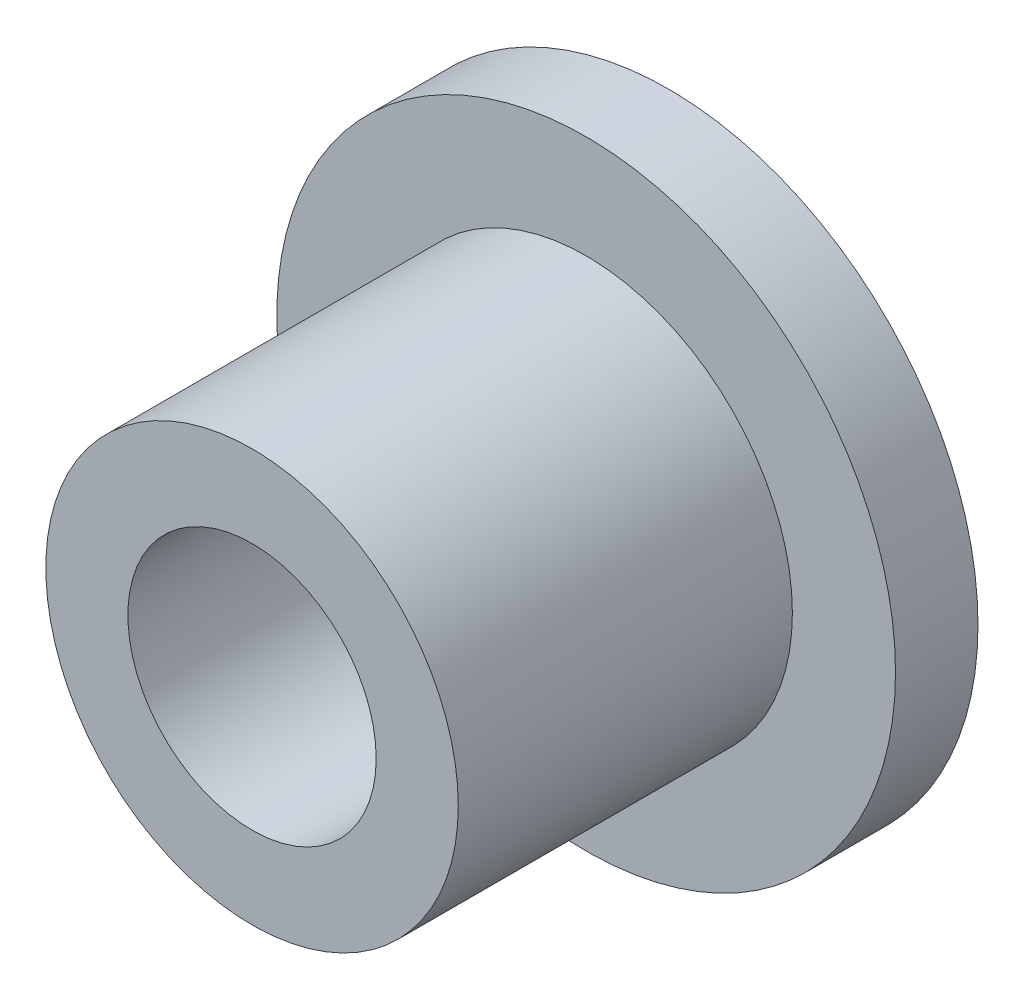
ISO-10303-21;
HEADER;
FILE_DESCRIPTION(('STEP AP214'),'2;1');
FILE_NAME('part.step','',(''),(''),'','','');
FILE_SCHEMA(('AUTOMOTIVE_DESIGN { 1 0 10303 214 1 1 1 1 }'));
ENDSEC;
DATA;
#1=APPLICATION_CONTEXT('core data for automotive mechanical design processes');
#2=APPLICATION_PROTOCOL_DEFINITION('international standard','automotive_design',2000,#1);
#3=PRODUCT_CONTEXT('',#1,'mechanical');
#4=PRODUCT('Part','Part','',(#3));
#5=PRODUCT_RELATED_PRODUCT_CATEGORY('part','',(#4));
#6=PRODUCT_DEFINITION_FORMATION('','',#4);
#7=PRODUCT_DEFINITION_CONTEXT('part definition',#1,'design');
#8=PRODUCT_DEFINITION('design','',#6,#7);
#9=PRODUCT_DEFINITION_SHAPE('','',#8);
#10=(LENGTH_UNIT() NAMED_UNIT(*) SI_UNIT(.MILLI.,.METRE.));
#11=(NAMED_UNIT(*) PLANE_ANGLE_UNIT() SI_UNIT($,.RADIAN.));
#12=(NAMED_UNIT(*) SI_UNIT($,.STERADIAN.) SOLID_ANGLE_UNIT());
#13=UNCERTAINTY_MEASURE_WITH_UNIT(LENGTH_MEASURE(1.E-05),#10,'distance_accuracy_value','');
#14=(GEOMETRIC_REPRESENTATION_CONTEXT(3) GLOBAL_UNCERTAINTY_ASSIGNED_CONTEXT((#13)) GLOBAL_UNIT_ASSIGNED_CONTEXT((#10,
#11,#12)) REPRESENTATION_CONTEXT('',''));
#15=CARTESIAN_POINT('',(0.,0.,0.));
#16=DIRECTION('',(0.,0.,1.));
#17=DIRECTION('',(1.,0.,0.));
#18=AXIS2_PLACEMENT_3D('',#15,#16,#17);
#19=CARTESIAN_POINT('',(0.,0.,2.));
#20=DIRECTION('',(0.,0.,1.));
#21=DIRECTION('',(1.,0.,0.));
#22=AXIS2_PLACEMENT_3D('',#19,#20,#21);
#23=PLANE('',#22);
#24=CARTESIAN_POINT('',(0.,0.,2.));
#25=DIRECTION('',(0.,0.,1.));
#26=DIRECTION('',(1.,0.,0.));
#27=AXIS2_PLACEMENT_3D('',#24,#25,#26);
#28=CIRCLE('',#27,5.);
#29=CARTESIAN_POINT('',(5.,0.,2.));
#30=VERTEX_POINT('',#29);
#31=EDGE_CURVE('E10',#30,#30,#28,.T.);
#32=ORIENTED_EDGE('',*,*,#31,.F.);
#33=EDGE_LOOP('',(#32));
#34=FACE_BOUND('',#33,.T.);
#35=CARTESIAN_POINT('',(0.,0.,2.));
#36=DIRECTION('',(0.,0.,1.));
#37=DIRECTION('',(1.,0.,0.));
#38=AXIS2_PLACEMENT_3D('',#35,#36,#37);
#39=CIRCLE('',#38,7.5);
#40=CARTESIAN_POINT('',(7.5,0.,2.));
#41=VERTEX_POINT('',#40);
#42=EDGE_CURVE('E44',#41,#41,#39,.T.);
#43=ORIENTED_EDGE('',*,*,#42,.T.);
#44=EDGE_LOOP('',(#43));
#45=FACE_BOUND('',#44,.T.);
#46=ADVANCED_FACE('F40',(#34,#45),#23,.T.);
#47=CARTESIAN_POINT('',(0.,0.,0.));
#48=DIRECTION('',(0.,0.,1.));
#49=DIRECTION('',(1.,0.,0.));
#50=AXIS2_PLACEMENT_3D('',#47,#48,#49);
#51=PLANE('',#50);
#52=CARTESIAN_POINT('',(0.,0.,0.));
#53=DIRECTION('',(0.,0.,1.));
#54=DIRECTION('',(1.,0.,0.));
#55=AXIS2_PLACEMENT_3D('',#52,#53,#54);
#56=CIRCLE('',#55,7.5);
#57=CARTESIAN_POINT('',(7.5,0.,0.));
#58=VERTEX_POINT('',#57);
#59=EDGE_CURVE('E41',#58,#58,#56,.T.);
#60=ORIENTED_EDGE('',*,*,#59,.F.);
#61=EDGE_LOOP('',(#60));
#62=FACE_BOUND('',#61,.T.);
#63=CARTESIAN_POINT('',(0.,0.,0.));
#64=DIRECTION('',(0.,0.,1.));
#65=DIRECTION('',(1.,0.,0.));
#66=AXIS2_PLACEMENT_3D('',#63,#64,#65);
#67=CIRCLE('',#66,3.01);
#68=CARTESIAN_POINT('',(3.01,0.,0.));
#69=VERTEX_POINT('',#68);
#70=EDGE_CURVE('E53',#69,#69,#67,.T.);
#71=ORIENTED_EDGE('',*,*,#70,.T.);
#72=EDGE_LOOP('',(#71));
#73=FACE_BOUND('',#72,.T.);
#74=ADVANCED_FACE('F82',(#62,#73),#51,.F.);
#75=CARTESIAN_POINT('',(0.,0.,2.));
#76=DIRECTION('',(0.,0.,-1.));
#77=DIRECTION('',(-1.,0.,0.));
#78=AXIS2_PLACEMENT_3D('',#75,#76,#77);
#79=CYLINDRICAL_SURFACE('',#78,7.5);
#80=ORIENTED_EDGE('',*,*,#42,.F.);
#81=EDGE_LOOP('',(#80));
#82=FACE_BOUND('',#81,.T.);
#83=ORIENTED_EDGE('',*,*,#59,.T.);
#84=EDGE_LOOP('',(#83));
#85=FACE_BOUND('',#84,.T.);
#86=ADVANCED_FACE('F39',(#82,#85),#79,.T.);
#87=CARTESIAN_POINT('',(0.,0.,2.));
#88=DIRECTION('',(0.,0.,-1.));
#89=DIRECTION('',(-1.,0.,0.));
#90=AXIS2_PLACEMENT_3D('',#87,#88,#89);
#91=CYLINDRICAL_SURFACE('',#90,3.01);
#92=ORIENTED_EDGE('',*,*,#70,.F.);
#93=EDGE_LOOP('',(#92));
#94=FACE_BOUND('',#93,.T.);
#95=CARTESIAN_POINT('',(0.,0.,10.1));
#96=DIRECTION('',(0.,0.,1.));
#97=DIRECTION('',(1.,0.,0.));
#98=AXIS2_PLACEMENT_3D('',#95,#96,#97);
#99=CIRCLE('',#98,3.01);
#100=CARTESIAN_POINT('',(3.01,0.,10.1));
#101=VERTEX_POINT('',#100);
#102=EDGE_CURVE('E58',#101,#101,#99,.T.);
#103=ORIENTED_EDGE('',*,*,#102,.T.);
#104=EDGE_LOOP('',(#103));
#105=FACE_BOUND('',#104,.T.);
#106=ADVANCED_FACE('F67',(#94,#105),#91,.F.);
#107=CARTESIAN_POINT('',(0.,0.,10.1));
#108=DIRECTION('',(0.,0.,1.));
#109=DIRECTION('',(1.,0.,0.));
#110=AXIS2_PLACEMENT_3D('',#107,#108,#109);
#111=PLANE('',#110);
#112=CARTESIAN_POINT('',(0.,0.,10.1));
#113=DIRECTION('',(0.,0.,1.));
#114=DIRECTION('',(1.,0.,0.));
#115=AXIS2_PLACEMENT_3D('',#112,#113,#114);
#116=CIRCLE('',#115,5.);
#117=CARTESIAN_POINT('',(5.,0.,10.1));
#118=VERTEX_POINT('',#117);
#119=EDGE_CURVE('E55',#118,#118,#116,.T.);
#120=ORIENTED_EDGE('',*,*,#119,.T.);
#121=EDGE_LOOP('',(#120));
#122=FACE_BOUND('',#121,.T.);
#123=ORIENTED_EDGE('',*,*,#102,.F.);
#124=EDGE_LOOP('',(#123));
#125=FACE_BOUND('',#124,.T.);
#126=ADVANCED_FACE('F69',(#122,#125),#111,.T.);
#127=CARTESIAN_POINT('',(0.,0.,10.1));
#128=DIRECTION('',(0.,0.,-1.));
#129=DIRECTION('',(-1.,0.,0.));
#130=AXIS2_PLACEMENT_3D('',#127,#128,#129);
#131=CYLINDRICAL_SURFACE('',#130,5.);
#132=ORIENTED_EDGE('',*,*,#119,.F.);
#133=EDGE_LOOP('',(#132));
#134=FACE_BOUND('',#133,.T.);
#135=ORIENTED_EDGE('',*,*,#31,.T.);
#136=EDGE_LOOP('',(#135));
#137=FACE_BOUND('',#136,.T.);
#138=ADVANCED_FACE('F68',(#134,#137),#131,.T.);
#139=CLOSED_SHELL('',(#46,#74,#86,#106,#126,#138));
#140=MANIFOLD_SOLID_BREP('B2',#139);
#141=ADVANCED_BREP_SHAPE_REPRESENTATION('',(#18,#140),#14);
#142=SHAPE_DEFINITION_REPRESENTATION(#9,#141);
ENDSEC;
END-ISO-10303-21;
